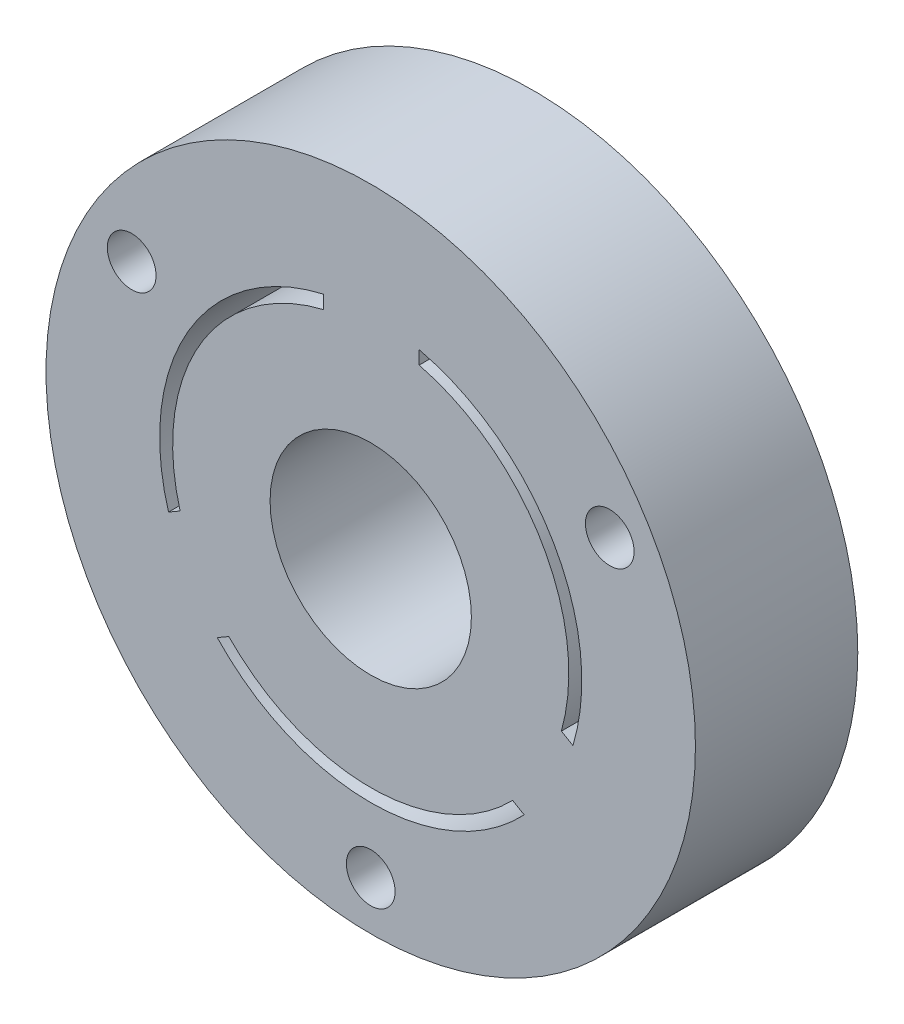
ISO-10303-21;
HEADER;
FILE_DESCRIPTION(('STEP AP214'),'2;1');
FILE_NAME('part.step','',(''),(''),'','','');
FILE_SCHEMA(('AUTOMOTIVE_DESIGN { 1 0 10303 214 1 1 1 1 }'));
ENDSEC;
DATA;
#1=APPLICATION_CONTEXT('core data for automotive mechanical design processes');
#2=APPLICATION_PROTOCOL_DEFINITION('international standard','automotive_design',2000,#1);
#3=PRODUCT_CONTEXT('',#1,'mechanical');
#4=PRODUCT('Part','Part','',(#3));
#5=PRODUCT_RELATED_PRODUCT_CATEGORY('part','',(#4));
#6=PRODUCT_DEFINITION_FORMATION('','',#4);
#7=PRODUCT_DEFINITION_CONTEXT('part definition',#1,'design');
#8=PRODUCT_DEFINITION('design','',#6,#7);
#9=PRODUCT_DEFINITION_SHAPE('','',#8);
#10=(LENGTH_UNIT() NAMED_UNIT(*) SI_UNIT(.MILLI.,.METRE.));
#11=(NAMED_UNIT(*) PLANE_ANGLE_UNIT() SI_UNIT($,.RADIAN.));
#12=(NAMED_UNIT(*) SI_UNIT($,.STERADIAN.) SOLID_ANGLE_UNIT());
#13=UNCERTAINTY_MEASURE_WITH_UNIT(LENGTH_MEASURE(1.E-05),#10,'distance_accuracy_value','');
#14=(GEOMETRIC_REPRESENTATION_CONTEXT(3) GLOBAL_UNCERTAINTY_ASSIGNED_CONTEXT((#13)) GLOBAL_UNIT_ASSIGNED_CONTEXT((#10,
#11,#12)) REPRESENTATION_CONTEXT('',''));
#15=CARTESIAN_POINT('',(0.,0.,0.));
#16=DIRECTION('',(0.,0.,1.));
#17=DIRECTION('',(1.,0.,0.));
#18=AXIS2_PLACEMENT_3D('',#15,#16,#17);
#19=CARTESIAN_POINT('',(48.2964743549606,27.9249074552953,5.));
#20=DIRECTION('',(0.,0.,-1.));
#21=DIRECTION('',(-1.,0.,0.));
#22=AXIS2_PLACEMENT_3D('',#19,#20,#21);
#23=CYLINDRICAL_SURFACE('',#22,6.50000000000001);
#24=CARTESIAN_POINT('',(48.2964743549606,27.9249074552953,0.));
#25=DIRECTION('',(0.,0.,1.));
#26=DIRECTION('',(1.,0.,0.));
#27=AXIS2_PLACEMENT_3D('',#24,#25,#26);
#28=CIRCLE('',#27,6.50000000000001);
#29=CARTESIAN_POINT('',(54.5236999300122,26.0616679008035,0.));
#30=VERTEX_POINT('',#29);
#31=CARTESIAN_POINT('',(49.7879309777147,34.2514829225163,0.));
#32=VERTEX_POINT('',#31);
#33=EDGE_CURVE('E215',#30,#32,#28,.T.);
#34=ORIENTED_EDGE('',*,*,#33,.F.);
#35=DIRECTION('',(0.,0.,-1.));
#36=VECTOR('',#35,1.);
#37=CARTESIAN_POINT('',(54.5236999300122,26.0616679008035,5.));
#38=LINE('',#37,#36);
#39=CARTESIAN_POINT('',(54.5236999300122,26.0616679008035,5.));
#40=VERTEX_POINT('',#39);
#41=EDGE_CURVE('E11',#40,#30,#38,.T.);
#42=ORIENTED_EDGE('',*,*,#41,.F.);
#43=CARTESIAN_POINT('',(48.2964743549606,27.9249074552953,5.));
#44=DIRECTION('',(0.,0.,1.));
#45=DIRECTION('',(1.,0.,0.));
#46=AXIS2_PLACEMENT_3D('',#43,#44,#45);
#47=CIRCLE('',#46,6.50000000000001);
#48=CARTESIAN_POINT('',(49.7879309777147,34.2514829225163,5.));
#49=VERTEX_POINT('',#48);
#50=EDGE_CURVE('E147',#40,#49,#47,.T.);
#51=ORIENTED_EDGE('',*,*,#50,.T.);
#52=DIRECTION('',(0.,0.,-1.));
#53=VECTOR('',#52,1.);
#54=CARTESIAN_POINT('',(49.7879309777147,34.2514829225163,5.));
#55=LINE('',#54,#53);
#56=EDGE_CURVE('E54',#49,#32,#55,.T.);
#57=ORIENTED_EDGE('',*,*,#56,.T.);
#58=EDGE_LOOP('',(#34,#42,#51,#57));
#59=FACE_BOUND('',#58,.T.);
#60=ADVANCED_FACE('F35',(#59),#23,.F.);
#61=CARTESIAN_POINT('',(24.9159582160477,43.1557055494579,5.));
#62=DIRECTION('',(-0.5,-0.866025403784439,0.));
#63=DIRECTION('',(0.866025403784439,-0.5,0.));
#64=AXIS2_PLACEMENT_3D('',#61,#62,#63);
#65=PLANE('',#64);
#66=DIRECTION('',(-0.866025403784439,0.5,0.));
#67=VECTOR('',#66,1.);
#68=CARTESIAN_POINT('',(24.9159582160477,43.1557055494579,0.));
#69=LINE('',#68,#67);
#70=CARTESIAN_POINT('',(54.1670212007574,26.267596461153,0.));
#71=VERTEX_POINT('',#70);
#72=EDGE_CURVE('E152',#30,#71,#69,.T.);
#73=ORIENTED_EDGE('',*,*,#72,.T.);
#74=DIRECTION('',(0.,0.,-1.));
#75=VECTOR('',#74,1.);
#76=CARTESIAN_POINT('',(54.1670212007574,26.267596461153,5.));
#77=LINE('',#76,#75);
#78=CARTESIAN_POINT('',(54.1670212007574,26.267596461153,5.));
#79=VERTEX_POINT('',#78);
#80=EDGE_CURVE('E45',#79,#71,#77,.T.);
#81=ORIENTED_EDGE('',*,*,#80,.F.);
#82=DIRECTION('',(-0.866025403784439,0.5,0.));
#83=VECTOR('',#82,1.);
#84=CARTESIAN_POINT('',(24.9159582160477,43.1557055494579,5.));
#85=LINE('',#84,#83);
#86=EDGE_CURVE('E139',#40,#79,#85,.T.);
#87=ORIENTED_EDGE('',*,*,#86,.F.);
#88=ORIENTED_EDGE('',*,*,#41,.T.);
#89=EDGE_LOOP('',(#73,#81,#87,#88));
#90=FACE_BOUND('',#89,.T.);
#91=ADVANCED_FACE('F150',(#90),#65,.F.);
#92=CARTESIAN_POINT('',(48.2964743549606,27.9249074552953,5.));
#93=DIRECTION('',(0.,0.,-1.));
#94=DIRECTION('',(-1.,0.,0.));
#95=AXIS2_PLACEMENT_3D('',#92,#93,#94);
#96=CYLINDRICAL_SURFACE('',#95,6.1);
#97=CARTESIAN_POINT('',(48.2964743549606,27.9249074552953,0.));
#98=DIRECTION('',(0.,0.,1.));
#99=DIRECTION('',(1.,0.,0.));
#100=AXIS2_PLACEMENT_3D('',#97,#98,#99);
#101=CIRCLE('',#100,6.1);
#102=CARTESIAN_POINT('',(49.7879309777147,33.8397664681918,0.));
#103=VERTEX_POINT('',#102);
#104=EDGE_CURVE('E191',#71,#103,#101,.T.);
#105=ORIENTED_EDGE('',*,*,#104,.T.);
#106=DIRECTION('',(0.,0.,-1.));
#107=VECTOR('',#106,1.);
#108=CARTESIAN_POINT('',(49.7879309777147,33.8397664681918,5.));
#109=LINE('',#108,#107);
#110=CARTESIAN_POINT('',(49.7879309777147,33.8397664681918,5.));
#111=VERTEX_POINT('',#110);
#112=EDGE_CURVE('E92',#111,#103,#109,.T.);
#113=ORIENTED_EDGE('',*,*,#112,.F.);
#114=CARTESIAN_POINT('',(48.2964743549606,27.9249074552953,5.));
#115=DIRECTION('',(0.,0.,1.));
#116=DIRECTION('',(1.,0.,0.));
#117=AXIS2_PLACEMENT_3D('',#114,#115,#116);
#118=CIRCLE('',#117,6.1);
#119=EDGE_CURVE('E131',#79,#111,#118,.T.);
#120=ORIENTED_EDGE('',*,*,#119,.F.);
#121=ORIENTED_EDGE('',*,*,#80,.T.);
#122=EDGE_LOOP('',(#105,#113,#120,#121));
#123=FACE_BOUND('',#122,.T.);
#124=ADVANCED_FACE('F133',(#123),#96,.T.);
#125=CARTESIAN_POINT('',(46.8483422096142,33.8505224689132,0.));
#126=VERTEX_POINT('',#125);
#127=CARTESIAN_POINT('',(42.4259275091637,26.267596461153,0.));
#128=VERTEX_POINT('',#127);
#129=EDGE_CURVE('E192',#126,#128,#101,.T.);
#130=ORIENTED_EDGE('',*,*,#129,.T.);
#131=DIRECTION('',(0.,0.,-1.));
#132=VECTOR('',#131,1.);
#133=CARTESIAN_POINT('',(42.4259275091637,26.267596461153,5.));
#134=LINE('',#133,#132);
#135=CARTESIAN_POINT('',(42.4259275091637,26.267596461153,5.));
#136=VERTEX_POINT('',#135);
#137=EDGE_CURVE('E164',#136,#128,#134,.T.);
#138=ORIENTED_EDGE('',*,*,#137,.F.);
#139=CARTESIAN_POINT('',(46.8483422096142,33.8505224689132,5.));
#140=VERTEX_POINT('',#139);
#141=EDGE_CURVE('E141',#140,#136,#118,.T.);
#142=ORIENTED_EDGE('',*,*,#141,.F.);
#143=DIRECTION('',(0.,0.,-1.));
#144=VECTOR('',#143,1.);
#145=CARTESIAN_POINT('',(46.8483422096142,33.8505224689132,5.));
#146=LINE('',#145,#144);
#147=EDGE_CURVE('E157',#140,#126,#146,.T.);
#148=ORIENTED_EDGE('',*,*,#147,.T.);
#149=EDGE_LOOP('',(#130,#138,#142,#148));
#150=FACE_BOUND('',#149,.T.);
#151=ADVANCED_FACE('F292',(#150),#96,.T.);
#152=CARTESIAN_POINT('',(-0.767721038567435,1.32973184483834,5.));
#153=DIRECTION('',(-0.5,0.866025403784438,0.));
#154=DIRECTION('',(-0.866025403784438,-0.5,0.));
#155=AXIS2_PLACEMENT_3D('',#152,#153,#154);
#156=PLANE('',#155);
#157=DIRECTION('',(0.866025403784439,0.5,0.));
#158=VECTOR('',#157,1.);
#159=CARTESIAN_POINT('',(-0.767721038567435,1.32973184483834,0.));
#160=LINE('',#159,#158);
#161=CARTESIAN_POINT('',(42.0692487799089,26.0616679008035,0.));
#162=VERTEX_POINT('',#161);
#163=EDGE_CURVE('E204',#162,#128,#160,.T.);
#164=ORIENTED_EDGE('',*,*,#163,.F.);
#165=DIRECTION('',(0.,0.,-1.));
#166=VECTOR('',#165,1.);
#167=CARTESIAN_POINT('',(42.0692487799089,26.0616679008035,5.));
#168=LINE('',#167,#166);
#169=CARTESIAN_POINT('',(42.0692487799089,26.0616679008035,5.));
#170=VERTEX_POINT('',#169);
#171=EDGE_CURVE('E162',#170,#162,#168,.T.);
#172=ORIENTED_EDGE('',*,*,#171,.F.);
#173=DIRECTION('',(0.866025403784439,0.5,0.));
#174=VECTOR('',#173,1.);
#175=CARTESIAN_POINT('',(-0.767721038567435,1.32973184483834,5.));
#176=LINE('',#175,#174);
#177=EDGE_CURVE('E237',#170,#136,#176,.T.);
#178=ORIENTED_EDGE('',*,*,#177,.T.);
#179=ORIENTED_EDGE('',*,*,#137,.T.);
#180=EDGE_LOOP('',(#164,#172,#178,#179));
#181=FACE_BOUND('',#180,.T.);
#182=ADVANCED_FACE('F288',(#181),#156,.T.);
#183=CARTESIAN_POINT('',(48.2964743549606,27.9249074552953,5.));
#184=DIRECTION('',(0.,0.,-1.));
#185=DIRECTION('',(-1.,0.,0.));
#186=AXIS2_PLACEMENT_3D('',#183,#184,#185);
#187=CYLINDRICAL_SURFACE('',#186,6.50000000000001);
#188=CARTESIAN_POINT('',(48.2964743549606,27.9249074552953,0.));
#189=DIRECTION('',(0.,0.,1.));
#190=DIRECTION('',(1.,0.,0.));
#191=AXIS2_PLACEMENT_3D('',#188,#189,#190);
#192=CIRCLE('',#191,6.50000000000001);
#193=CARTESIAN_POINT('',(46.8483422096142,34.261540101237,0.));
#194=VERTEX_POINT('',#193);
#195=EDGE_CURVE('E207',#194,#162,#192,.T.);
#196=ORIENTED_EDGE('',*,*,#195,.F.);
#197=DIRECTION('',(0.,0.,-1.));
#198=VECTOR('',#197,1.);
#199=CARTESIAN_POINT('',(46.8483422096142,34.261540101237,5.));
#200=LINE('',#199,#198);
#201=CARTESIAN_POINT('',(46.8483422096142,34.261540101237,5.));
#202=VERTEX_POINT('',#201);
#203=EDGE_CURVE('E160',#202,#194,#200,.T.);
#204=ORIENTED_EDGE('',*,*,#203,.F.);
#205=CARTESIAN_POINT('',(48.2964743549606,27.9249074552953,5.));
#206=DIRECTION('',(0.,0.,1.));
#207=DIRECTION('',(1.,0.,0.));
#208=AXIS2_PLACEMENT_3D('',#205,#206,#207);
#209=CIRCLE('',#208,6.50000000000001);
#210=EDGE_CURVE('E240',#202,#170,#209,.T.);
#211=ORIENTED_EDGE('',*,*,#210,.T.);
#212=ORIENTED_EDGE('',*,*,#171,.T.);
#213=EDGE_LOOP('',(#196,#204,#211,#212));
#214=FACE_BOUND('',#213,.T.);
#215=ADVANCED_FACE('F285',(#214),#187,.F.);
#216=CARTESIAN_POINT('',(0.732278961432563,-1.26834436651497,5.));
#217=DIRECTION('',(0.5,-0.866025403784439,0.));
#218=DIRECTION('',(0.866025403784439,0.5,0.));
#219=AXIS2_PLACEMENT_3D('',#216,#217,#218);
#220=PLANE('',#219);
#221=DIRECTION('',(-0.866025403784439,-0.5,0.));
#222=VECTOR('',#221,1.);
#223=CARTESIAN_POINT('',(0.732278961432563,-1.26834436651497,0.));
#224=LINE('',#223,#222);
#225=CARTESIAN_POINT('',(43.9259275091637,23.6695202497997,0.));
#226=VERTEX_POINT('',#225);
#227=CARTESIAN_POINT('',(43.5692487799089,23.4635916894502,0.));
#228=VERTEX_POINT('',#227);
#229=EDGE_CURVE('E187',#226,#228,#224,.T.);
#230=ORIENTED_EDGE('',*,*,#229,.F.);
#231=DIRECTION('',(0.,0.,-1.));
#232=VECTOR('',#231,1.);
#233=CARTESIAN_POINT('',(43.9259275091637,23.6695202497997,5.));
#234=LINE('',#233,#232);
#235=CARTESIAN_POINT('',(43.9259275091637,23.6695202497997,5.));
#236=VERTEX_POINT('',#235);
#237=EDGE_CURVE('E39',#236,#226,#234,.T.);
#238=ORIENTED_EDGE('',*,*,#237,.F.);
#239=DIRECTION('',(-0.866025403784439,-0.5,0.));
#240=VECTOR('',#239,1.);
#241=CARTESIAN_POINT('',(0.732278961432563,-1.26834436651497,5.));
#242=LINE('',#241,#240);
#243=CARTESIAN_POINT('',(43.5692487799089,23.4635916894502,5.));
#244=VERTEX_POINT('',#243);
#245=EDGE_CURVE('E223',#236,#244,#242,.T.);
#246=ORIENTED_EDGE('',*,*,#245,.T.);
#247=DIRECTION('',(0.,0.,-1.));
#248=VECTOR('',#247,1.);
#249=CARTESIAN_POINT('',(43.5692487799089,23.4635916894502,5.));
#250=LINE('',#249,#248);
#251=EDGE_CURVE('E166',#244,#228,#250,.T.);
#252=ORIENTED_EDGE('',*,*,#251,.T.);
#253=EDGE_LOOP('',(#230,#238,#246,#252));
#254=FACE_BOUND('',#253,.T.);
#255=ADVANCED_FACE('F37',(#254),#220,.T.);
#256=CARTESIAN_POINT('',(52.6670212007574,23.6695202497997,0.));
#257=VERTEX_POINT('',#256);
#258=EDGE_CURVE('E180',#226,#257,#101,.T.);
#259=ORIENTED_EDGE('',*,*,#258,.T.);
#260=DIRECTION('',(0.,0.,-1.));
#261=VECTOR('',#260,1.);
#262=CARTESIAN_POINT('',(52.6670212007574,23.6695202497997,5.));
#263=LINE('',#262,#261);
#264=CARTESIAN_POINT('',(52.6670212007574,23.6695202497997,5.));
#265=VERTEX_POINT('',#264);
#266=EDGE_CURVE('E170',#265,#257,#263,.T.);
#267=ORIENTED_EDGE('',*,*,#266,.F.);
#268=EDGE_CURVE('E142',#236,#265,#118,.T.);
#269=ORIENTED_EDGE('',*,*,#268,.F.);
#270=ORIENTED_EDGE('',*,*,#237,.T.);
#271=EDGE_LOOP('',(#259,#267,#269,#270));
#272=FACE_BOUND('',#271,.T.);
#273=ADVANCED_FACE('F179',(#272),#96,.T.);
#274=CARTESIAN_POINT('',(23.4159582160477,40.5576293381045,5.));
#275=DIRECTION('',(0.5,0.866025403784439,0.));
#276=DIRECTION('',(-0.866025403784439,0.5,0.));
#277=AXIS2_PLACEMENT_3D('',#274,#275,#276);
#278=PLANE('',#277);
#279=DIRECTION('',(0.866025403784439,-0.5,0.));
#280=VECTOR('',#279,1.);
#281=CARTESIAN_POINT('',(23.4159582160477,40.5576293381045,0.));
#282=LINE('',#281,#280);
#283=CARTESIAN_POINT('',(53.0236999300122,23.4635916894502,0.));
#284=VERTEX_POINT('',#283);
#285=EDGE_CURVE('E189',#257,#284,#282,.T.);
#286=ORIENTED_EDGE('',*,*,#285,.T.);
#287=DIRECTION('',(0.,0.,-1.));
#288=VECTOR('',#287,1.);
#289=CARTESIAN_POINT('',(53.0236999300122,23.4635916894502,5.));
#290=LINE('',#289,#288);
#291=CARTESIAN_POINT('',(53.0236999300122,23.4635916894502,5.));
#292=VERTEX_POINT('',#291);
#293=EDGE_CURVE('E168',#292,#284,#290,.T.);
#294=ORIENTED_EDGE('',*,*,#293,.F.);
#295=DIRECTION('',(0.866025403784439,-0.5,0.));
#296=VECTOR('',#295,1.);
#297=CARTESIAN_POINT('',(23.4159582160477,40.5576293381045,5.));
#298=LINE('',#297,#296);
#299=EDGE_CURVE('E228',#265,#292,#298,.T.);
#300=ORIENTED_EDGE('',*,*,#299,.F.);
#301=ORIENTED_EDGE('',*,*,#266,.T.);
#302=EDGE_LOOP('',(#286,#294,#300,#301));
#303=FACE_BOUND('',#302,.T.);
#304=ADVANCED_FACE('F296',(#303),#278,.F.);
#305=CARTESIAN_POINT('',(49.7879309777147,0.,5.));
#306=DIRECTION('',(1.,0.,0.));
#307=DIRECTION('',(0.,1.,0.));
#308=AXIS2_PLACEMENT_3D('',#305,#306,#307);
#309=PLANE('',#308);
#310=DIRECTION('',(0.,-1.,0.));
#311=VECTOR('',#310,1.);
#312=CARTESIAN_POINT('',(49.7879309777147,0.,0.));
#313=LINE('',#312,#311);
#314=EDGE_CURVE('E218',#32,#103,#313,.T.);
#315=ORIENTED_EDGE('',*,*,#314,.F.);
#316=ORIENTED_EDGE('',*,*,#56,.F.);
#317=DIRECTION('',(0.,-1.,0.));
#318=VECTOR('',#317,1.);
#319=CARTESIAN_POINT('',(49.7879309777147,0.,5.));
#320=LINE('',#319,#318);
#321=EDGE_CURVE('E138',#49,#111,#320,.T.);
#322=ORIENTED_EDGE('',*,*,#321,.T.);
#323=ORIENTED_EDGE('',*,*,#112,.T.);
#324=EDGE_LOOP('',(#315,#316,#322,#323));
#325=FACE_BOUND('',#324,.T.);
#326=ADVANCED_FACE('F280',(#325),#309,.T.);
#327=CARTESIAN_POINT('',(48.2964743549606,27.9249074552953,5.));
#328=DIRECTION('',(0.,0.,-1.));
#329=DIRECTION('',(-1.,0.,0.));
#330=AXIS2_PLACEMENT_3D('',#327,#328,#329);
#331=CYLINDRICAL_SURFACE('',#330,10.);
#332=CARTESIAN_POINT('',(48.2964743549606,27.9249074552953,5.));
#333=DIRECTION('',(0.,0.,1.));
#334=DIRECTION('',(1.,0.,0.));
#335=AXIS2_PLACEMENT_3D('',#332,#333,#334);
#336=CIRCLE('',#335,10.);
#337=CARTESIAN_POINT('',(58.2964743549606,27.9249074552953,5.));
#338=VERTEX_POINT('',#337);
#339=EDGE_CURVE('E245',#338,#338,#336,.T.);
#340=ORIENTED_EDGE('',*,*,#339,.F.);
#341=EDGE_LOOP('',(#340));
#342=FACE_BOUND('',#341,.T.);
#343=CARTESIAN_POINT('',(48.2964743549606,27.9249074552953,0.));
#344=DIRECTION('',(0.,0.,1.));
#345=DIRECTION('',(1.,0.,0.));
#346=AXIS2_PLACEMENT_3D('',#343,#344,#345);
#347=CIRCLE('',#346,10.);
#348=CARTESIAN_POINT('',(58.2964743549606,27.9249074552953,0.));
#349=VERTEX_POINT('',#348);
#350=EDGE_CURVE('E212',#349,#349,#347,.T.);
#351=ORIENTED_EDGE('',*,*,#350,.T.);
#352=EDGE_LOOP('',(#351));
#353=FACE_BOUND('',#352,.T.);
#354=ADVANCED_FACE('F276',(#342,#353),#331,.T.);
#355=CARTESIAN_POINT('',(46.8483422096142,0.,5.));
#356=DIRECTION('',(1.,0.,0.));
#357=DIRECTION('',(0.,1.,0.));
#358=AXIS2_PLACEMENT_3D('',#355,#356,#357);
#359=PLANE('',#358);
#360=DIRECTION('',(0.,-1.,0.));
#361=VECTOR('',#360,1.);
#362=CARTESIAN_POINT('',(46.8483422096142,0.,0.));
#363=LINE('',#362,#361);
#364=EDGE_CURVE('E210',#194,#126,#363,.T.);
#365=ORIENTED_EDGE('',*,*,#364,.T.);
#366=ORIENTED_EDGE('',*,*,#147,.F.);
#367=DIRECTION('',(0.,-1.,0.));
#368=VECTOR('',#367,1.);
#369=CARTESIAN_POINT('',(46.8483422096142,0.,5.));
#370=LINE('',#369,#368);
#371=EDGE_CURVE('E243',#202,#140,#370,.T.);
#372=ORIENTED_EDGE('',*,*,#371,.F.);
#373=ORIENTED_EDGE('',*,*,#203,.T.);
#374=EDGE_LOOP('',(#365,#366,#372,#373));
#375=FACE_BOUND('',#374,.T.);
#376=ADVANCED_FACE('F279',(#375),#359,.F.);
#377=CARTESIAN_POINT('',(48.2964743549606,27.9249074552953,5.));
#378=DIRECTION('',(0.,0.,-1.));
#379=DIRECTION('',(-1.,0.,0.));
#380=AXIS2_PLACEMENT_3D('',#377,#378,#379);
#381=CYLINDRICAL_SURFACE('',#380,6.50000000000001);
#382=CARTESIAN_POINT('',(48.2964743549606,27.9249074552953,0.));
#383=DIRECTION('',(0.,0.,1.));
#384=DIRECTION('',(1.,0.,0.));
#385=AXIS2_PLACEMENT_3D('',#382,#383,#384);
#386=CIRCLE('',#385,6.50000000000001);
#387=EDGE_CURVE('E202',#228,#284,#386,.T.);
#388=ORIENTED_EDGE('',*,*,#387,.F.);
#389=ORIENTED_EDGE('',*,*,#251,.F.);
#390=CARTESIAN_POINT('',(48.2964743549606,27.9249074552953,5.));
#391=DIRECTION('',(0.,0.,1.));
#392=DIRECTION('',(1.,0.,0.));
#393=AXIS2_PLACEMENT_3D('',#390,#391,#392);
#394=CIRCLE('',#393,6.50000000000001);
#395=EDGE_CURVE('E234',#244,#292,#394,.T.);
#396=ORIENTED_EDGE('',*,*,#395,.T.);
#397=ORIENTED_EDGE('',*,*,#293,.T.);
#398=EDGE_LOOP('',(#388,#389,#396,#397));
#399=FACE_BOUND('',#398,.T.);
#400=ADVANCED_FACE('F263',(#399),#381,.F.);
#401=CARTESIAN_POINT('',(48.2964743549606,27.9249074552953,5.));
#402=DIRECTION('',(0.,0.,-1.));
#403=DIRECTION('',(-1.,0.,0.));
#404=AXIS2_PLACEMENT_3D('',#401,#402,#403);
#405=CYLINDRICAL_SURFACE('',#404,3.1);
#406=CARTESIAN_POINT('',(48.2964743549606,27.9249074552953,5.));
#407=DIRECTION('',(0.,0.,1.));
#408=DIRECTION('',(1.,0.,0.));
#409=AXIS2_PLACEMENT_3D('',#406,#407,#408);
#410=CIRCLE('',#409,3.1);
#411=CARTESIAN_POINT('',(51.3964743549606,27.9249074552953,5.));
#412=VERTEX_POINT('',#411);
#413=EDGE_CURVE('E169',#412,#412,#410,.T.);
#414=ORIENTED_EDGE('',*,*,#413,.T.);
#415=EDGE_LOOP('',(#414));
#416=FACE_BOUND('',#415,.T.);
#417=CARTESIAN_POINT('',(48.2964743549606,27.9249074552953,0.));
#418=DIRECTION('',(0.,0.,1.));
#419=DIRECTION('',(1.,0.,0.));
#420=AXIS2_PLACEMENT_3D('',#417,#418,#419);
#421=CIRCLE('',#420,3.1);
#422=CARTESIAN_POINT('',(51.3964743549606,27.9249074552953,0.));
#423=VERTEX_POINT('',#422);
#424=EDGE_CURVE('E221',#423,#423,#421,.T.);
#425=ORIENTED_EDGE('',*,*,#424,.F.);
#426=EDGE_LOOP('',(#425));
#427=FACE_BOUND('',#426,.T.);
#428=ADVANCED_FACE('F251',(#416,#427),#405,.F.);
#429=CARTESIAN_POINT('',(0.,0.,5.));
#430=DIRECTION('',(0.,0.,1.));
#431=DIRECTION('',(1.,0.,0.));
#432=AXIS2_PLACEMENT_3D('',#429,#430,#431);
#433=PLANE('',#432);
#434=CARTESIAN_POINT('',(40.9352584227928,32.1749074552953,5.));
#435=DIRECTION('',(0.,0.,1.));
#436=DIRECTION('',(1.,0.,0.));
#437=AXIS2_PLACEMENT_3D('',#434,#435,#436);
#438=CIRCLE('',#437,0.749999999999999);
#439=CARTESIAN_POINT('',(41.6852584227928,32.1749074552953,5.));
#440=VERTEX_POINT('',#439);
#441=EDGE_CURVE('E196',#440,#440,#438,.T.);
#442=ORIENTED_EDGE('',*,*,#441,.F.);
#443=EDGE_LOOP('',(#442));
#444=FACE_BOUND('',#443,.T.);
#445=CARTESIAN_POINT('',(48.2964743549606,19.4249074552953,5.));
#446=DIRECTION('',(0.,0.,1.));
#447=DIRECTION('',(1.,0.,0.));
#448=AXIS2_PLACEMENT_3D('',#445,#446,#447);
#449=CIRCLE('',#448,0.749999999999999);
#450=CARTESIAN_POINT('',(49.0464743549606,19.4249074552953,5.));
#451=VERTEX_POINT('',#450);
#452=EDGE_CURVE('E508',#451,#451,#449,.T.);
#453=ORIENTED_EDGE('',*,*,#452,.F.);
#454=EDGE_LOOP('',(#453));
#455=FACE_BOUND('',#454,.T.);
#456=CARTESIAN_POINT('',(55.6576902871283,32.1749074552953,5.));
#457=DIRECTION('',(0.,0.,1.));
#458=DIRECTION('',(1.,0.,0.));
#459=AXIS2_PLACEMENT_3D('',#456,#457,#458);
#460=CIRCLE('',#459,0.749999999999999);
#461=CARTESIAN_POINT('',(56.4076902871283,32.1749074552953,5.));
#462=VERTEX_POINT('',#461);
#463=EDGE_CURVE('E230',#462,#462,#460,.T.);
#464=ORIENTED_EDGE('',*,*,#463,.F.);
#465=EDGE_LOOP('',(#464));
#466=FACE_BOUND('',#465,.T.);
#467=ORIENTED_EDGE('',*,*,#245,.F.);
#468=ORIENTED_EDGE('',*,*,#268,.T.);
#469=ORIENTED_EDGE('',*,*,#299,.T.);
#470=ORIENTED_EDGE('',*,*,#395,.F.);
#471=EDGE_LOOP('',(#467,#468,#469,#470));
#472=FACE_BOUND('',#471,.T.);
#473=ORIENTED_EDGE('',*,*,#141,.T.);
#474=ORIENTED_EDGE('',*,*,#177,.F.);
#475=ORIENTED_EDGE('',*,*,#210,.F.);
#476=ORIENTED_EDGE('',*,*,#371,.T.);
#477=EDGE_LOOP('',(#473,#474,#475,#476));
#478=FACE_BOUND('',#477,.T.);
#479=ORIENTED_EDGE('',*,*,#339,.T.);
#480=EDGE_LOOP('',(#479));
#481=FACE_BOUND('',#480,.T.);
#482=ORIENTED_EDGE('',*,*,#50,.F.);
#483=ORIENTED_EDGE('',*,*,#86,.T.);
#484=ORIENTED_EDGE('',*,*,#119,.T.);
#485=ORIENTED_EDGE('',*,*,#321,.F.);
#486=EDGE_LOOP('',(#482,#483,#484,#485));
#487=FACE_BOUND('',#486,.T.);
#488=ORIENTED_EDGE('',*,*,#413,.F.);
#489=EDGE_LOOP('',(#488));
#490=FACE_BOUND('',#489,.T.);
#491=ADVANCED_FACE('F145',(#444,#455,#466,#472,#478,#481,#487,#490),#433,.T.);
#492=CARTESIAN_POINT('',(0.,0.,0.));
#493=DIRECTION('',(0.,0.,1.));
#494=DIRECTION('',(1.,0.,0.));
#495=AXIS2_PLACEMENT_3D('',#492,#493,#494);
#496=PLANE('',#495);
#497=CARTESIAN_POINT('',(40.9352584227928,32.1749074552953,0.));
#498=DIRECTION('',(0.,0.,1.));
#499=DIRECTION('',(1.,0.,0.));
#500=AXIS2_PLACEMENT_3D('',#497,#498,#499);
#501=CIRCLE('',#500,0.749999999999999);
#502=CARTESIAN_POINT('',(41.6852584227928,32.1749074552953,0.));
#503=VERTEX_POINT('',#502);
#504=EDGE_CURVE('E193',#503,#503,#501,.T.);
#505=ORIENTED_EDGE('',*,*,#504,.T.);
#506=EDGE_LOOP('',(#505));
#507=FACE_BOUND('',#506,.T.);
#508=CARTESIAN_POINT('',(48.2964743549606,19.4249074552953,0.));
#509=DIRECTION('',(0.,0.,1.));
#510=DIRECTION('',(1.,0.,0.));
#511=AXIS2_PLACEMENT_3D('',#508,#509,#510);
#512=CIRCLE('',#511,0.749999999999999);
#513=CARTESIAN_POINT('',(49.0464743549606,19.4249074552953,0.));
#514=VERTEX_POINT('',#513);
#515=EDGE_CURVE('E505',#514,#514,#512,.T.);
#516=ORIENTED_EDGE('',*,*,#515,.T.);
#517=EDGE_LOOP('',(#516));
#518=FACE_BOUND('',#517,.T.);
#519=CARTESIAN_POINT('',(55.6576902871283,32.1749074552953,0.));
#520=DIRECTION('',(0.,0.,1.));
#521=DIRECTION('',(1.,0.,0.));
#522=AXIS2_PLACEMENT_3D('',#519,#520,#521);
#523=CIRCLE('',#522,0.749999999999999);
#524=CARTESIAN_POINT('',(56.4076902871283,32.1749074552953,0.));
#525=VERTEX_POINT('',#524);
#526=EDGE_CURVE('E512',#525,#525,#523,.T.);
#527=ORIENTED_EDGE('',*,*,#526,.T.);
#528=EDGE_LOOP('',(#527));
#529=FACE_BOUND('',#528,.T.);
#530=ORIENTED_EDGE('',*,*,#229,.T.);
#531=ORIENTED_EDGE('',*,*,#387,.T.);
#532=ORIENTED_EDGE('',*,*,#285,.F.);
#533=ORIENTED_EDGE('',*,*,#258,.F.);
#534=EDGE_LOOP('',(#530,#531,#532,#533));
#535=FACE_BOUND('',#534,.T.);
#536=ORIENTED_EDGE('',*,*,#129,.F.);
#537=ORIENTED_EDGE('',*,*,#364,.F.);
#538=ORIENTED_EDGE('',*,*,#195,.T.);
#539=ORIENTED_EDGE('',*,*,#163,.T.);
#540=EDGE_LOOP('',(#536,#537,#538,#539));
#541=FACE_BOUND('',#540,.T.);
#542=ORIENTED_EDGE('',*,*,#350,.F.);
#543=EDGE_LOOP('',(#542));
#544=FACE_BOUND('',#543,.T.);
#545=ORIENTED_EDGE('',*,*,#33,.T.);
#546=ORIENTED_EDGE('',*,*,#314,.T.);
#547=ORIENTED_EDGE('',*,*,#104,.F.);
#548=ORIENTED_EDGE('',*,*,#72,.F.);
#549=EDGE_LOOP('',(#545,#546,#547,#548));
#550=FACE_BOUND('',#549,.T.);
#551=ORIENTED_EDGE('',*,*,#424,.T.);
#552=EDGE_LOOP('',(#551));
#553=FACE_BOUND('',#552,.T.);
#554=ADVANCED_FACE('F184',(#507,#518,#529,#535,#541,#544,#550,#553),#496,.F.);
#555=CARTESIAN_POINT('',(55.6576902871283,32.1749074552953,0.));
#556=DIRECTION('',(0.,0.,1.));
#557=DIRECTION('',(1.,0.,0.));
#558=AXIS2_PLACEMENT_3D('',#555,#556,#557);
#559=CYLINDRICAL_SURFACE('',#558,0.749999999999999);
#560=ORIENTED_EDGE('',*,*,#526,.F.);
#561=EDGE_LOOP('',(#560));
#562=FACE_BOUND('',#561,.T.);
#563=ORIENTED_EDGE('',*,*,#463,.T.);
#564=EDGE_LOOP('',(#563));
#565=FACE_BOUND('',#564,.T.);
#566=ADVANCED_FACE('F260',(#562,#565),#559,.F.);
#567=CARTESIAN_POINT('',(48.2964743549606,19.4249074552953,0.));
#568=DIRECTION('',(0.,0.,1.));
#569=DIRECTION('',(1.,0.,0.));
#570=AXIS2_PLACEMENT_3D('',#567,#568,#569);
#571=CYLINDRICAL_SURFACE('',#570,0.749999999999999);
#572=ORIENTED_EDGE('',*,*,#515,.F.);
#573=EDGE_LOOP('',(#572));
#574=FACE_BOUND('',#573,.T.);
#575=ORIENTED_EDGE('',*,*,#452,.T.);
#576=EDGE_LOOP('',(#575));
#577=FACE_BOUND('',#576,.T.);
#578=ADVANCED_FACE('F479',(#574,#577),#571,.F.);
#579=CARTESIAN_POINT('',(40.9352584227928,32.1749074552953,0.));
#580=DIRECTION('',(0.,0.,1.));
#581=DIRECTION('',(1.,0.,0.));
#582=AXIS2_PLACEMENT_3D('',#579,#580,#581);
#583=CYLINDRICAL_SURFACE('',#582,0.749999999999999);
#584=ORIENTED_EDGE('',*,*,#504,.F.);
#585=EDGE_LOOP('',(#584));
#586=FACE_BOUND('',#585,.T.);
#587=ORIENTED_EDGE('',*,*,#441,.T.);
#588=EDGE_LOOP('',(#587));
#589=FACE_BOUND('',#588,.T.);
#590=ADVANCED_FACE('F487',(#586,#589),#583,.F.);
#591=CLOSED_SHELL('',(#60,#91,#124,#151,#182,#215,#255,#273,#304,#326,#354,#376,#400,#428,#491,
#554,#566,#578,#590));
#592=MANIFOLD_SOLID_BREP('B2',#591);
#593=ADVANCED_BREP_SHAPE_REPRESENTATION('',(#18,#592),#14);
#594=SHAPE_DEFINITION_REPRESENTATION(#9,#593);
ENDSEC;
END-ISO-10303-21;
